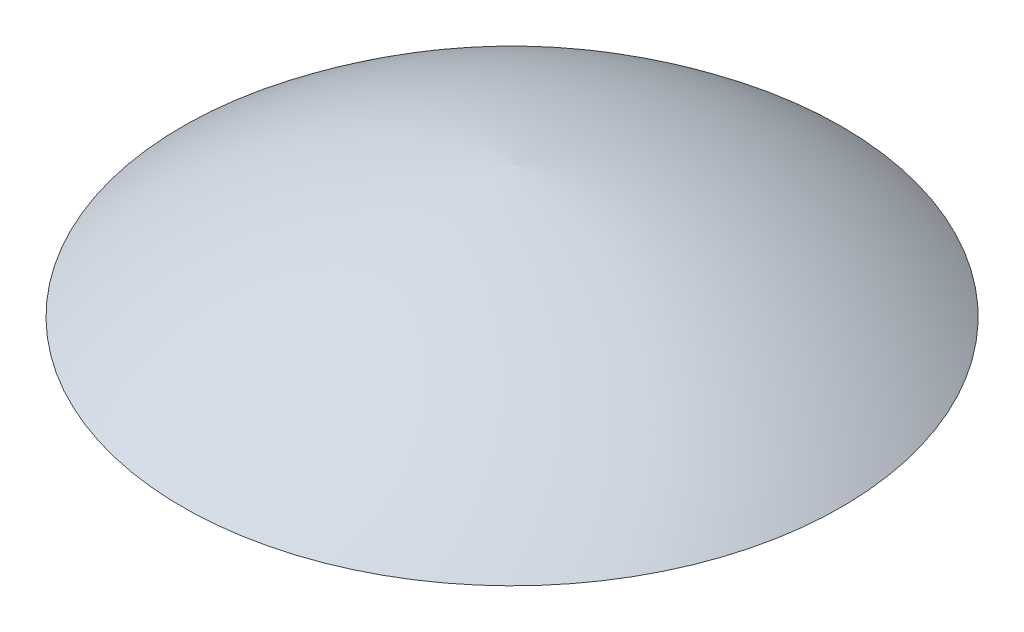
ISO-10303-21;
HEADER;
FILE_DESCRIPTION(('STEP AP214'),'2;1');
FILE_NAME('part.step','',(''),(''),'','','');
FILE_SCHEMA(('AUTOMOTIVE_DESIGN { 1 0 10303 214 1 1 1 1 }'));
ENDSEC;
DATA;
#1=APPLICATION_CONTEXT('core data for automotive mechanical design processes');
#2=APPLICATION_PROTOCOL_DEFINITION('international standard','automotive_design',2000,#1);
#3=PRODUCT_CONTEXT('',#1,'mechanical');
#4=PRODUCT('Part','Part','',(#3));
#5=PRODUCT_RELATED_PRODUCT_CATEGORY('part','',(#4));
#6=PRODUCT_DEFINITION_FORMATION('','',#4);
#7=PRODUCT_DEFINITION_CONTEXT('part definition',#1,'design');
#8=PRODUCT_DEFINITION('design','',#6,#7);
#9=PRODUCT_DEFINITION_SHAPE('','',#8);
#10=(LENGTH_UNIT() NAMED_UNIT(*) SI_UNIT(.MILLI.,.METRE.));
#11=(NAMED_UNIT(*) PLANE_ANGLE_UNIT() SI_UNIT($,.RADIAN.));
#12=(NAMED_UNIT(*) SI_UNIT($,.STERADIAN.) SOLID_ANGLE_UNIT());
#13=UNCERTAINTY_MEASURE_WITH_UNIT(LENGTH_MEASURE(1.E-05),#10,'distance_accuracy_value','');
#14=(GEOMETRIC_REPRESENTATION_CONTEXT(3) GLOBAL_UNCERTAINTY_ASSIGNED_CONTEXT((#13)) GLOBAL_UNIT_ASSIGNED_CONTEXT((#10,
#11,#12)) REPRESENTATION_CONTEXT('',''));
#15=CARTESIAN_POINT('',(0.,0.,0.));
#16=DIRECTION('',(0.,0.,1.));
#17=DIRECTION('',(1.,0.,0.));
#18=AXIS2_PLACEMENT_3D('',#15,#16,#17);
#19=CARTESIAN_POINT('',(0.,-46.7858872109874,5.06435488439495));
#20=DIRECTION('',(-1.,0.,0.));
#21=DIRECTION('',(0.,0.,-1.));
#22=AXIS2_PLACEMENT_3D('',#19,#20,#21);
#23=CIRCLE('',#22,60.);
#24=TRIMMED_CURVE('',#23,(PARAMETER_VALUE(-1.48628986637615)),
(PARAMETER_VALUE(1.48628986637615)),.T.,.PARAMETER.);
#25=CARTESIAN_POINT('',(0.,-46.7858872109874,0.));
#26=DIRECTION('',(0.,-1.,0.));
#27=AXIS1_PLACEMENT('',#25,#26);
#28=SURFACE_OF_REVOLUTION('',#24,#27);
#29=CARTESIAN_POINT('',(0.,13.,0.));
#30=VERTEX_POINT('',#29);
#31=VERTEX_LOOP('',#30);
#32=FACE_BOUND('',#31,.T.);
#33=CARTESIAN_POINT('',(0.,0.,0.));
#34=DIRECTION('',(0.,-1.,0.));
#35=DIRECTION('',(0.,0.,-1.));
#36=AXIS2_PLACEMENT_3D('',#33,#34,#35);
#37=CIRCLE('',#36,32.5);
#38=CARTESIAN_POINT('',(0.,0.,-32.5));
#39=VERTEX_POINT('',#38);
#40=EDGE_CURVE('E11',#39,#39,#37,.T.);
#41=ORIENTED_EDGE('',*,*,#40,.F.);
#42=EDGE_LOOP('',(#41));
#43=FACE_BOUND('',#42,.T.);
#44=ADVANCED_FACE('F43',(#32,#43),#28,.T.);
#45=CARTESIAN_POINT('',(0.,0.,0.));
#46=DIRECTION('',(0.,-1.,0.));
#47=DIRECTION('',(0.,0.,-1.));
#48=AXIS2_PLACEMENT_3D('',#45,#46,#47);
#49=PLANE('',#48);
#50=ORIENTED_EDGE('',*,*,#40,.T.);
#51=EDGE_LOOP('',(#50));
#52=FACE_BOUND('',#51,.T.);
#53=ADVANCED_FACE('F53',(#52),#49,.T.);
#54=CLOSED_SHELL('',(#44,#53));
#55=MANIFOLD_SOLID_BREP('B2',#54);
#56=ADVANCED_BREP_SHAPE_REPRESENTATION('',(#18,#55),#14);
#57=SHAPE_DEFINITION_REPRESENTATION(#9,#56);
ENDSEC;
END-ISO-10303-21;
